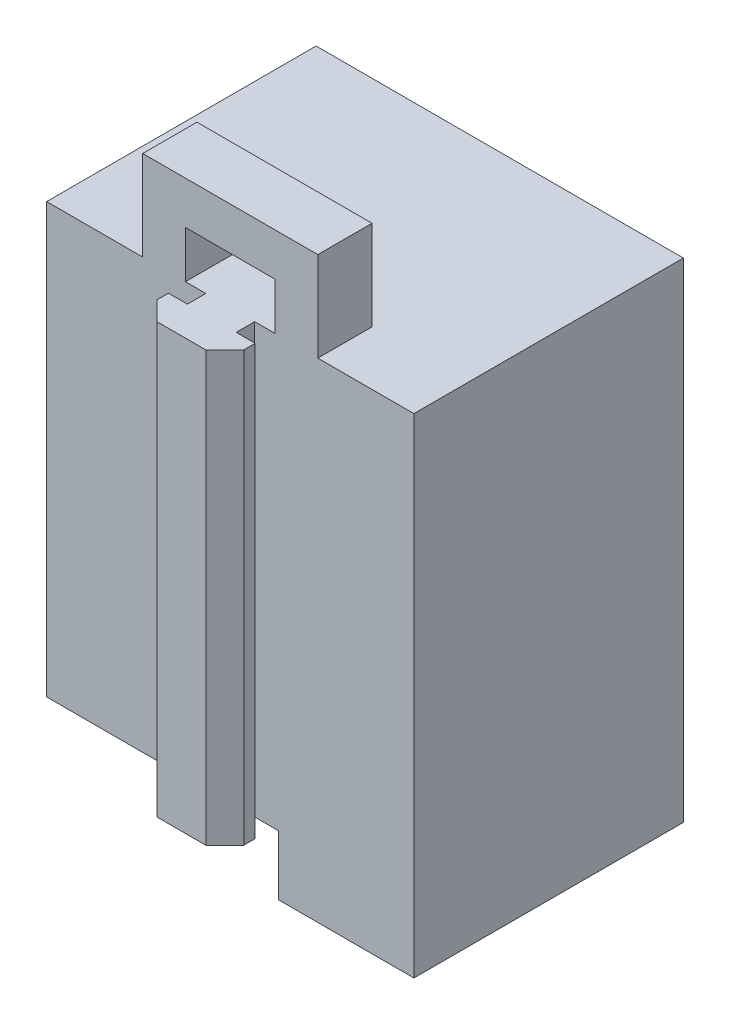
ISO-10303-21;
HEADER;
FILE_DESCRIPTION(('STEP AP214'),'2;1');
FILE_NAME('part.step','',(''),(''),'','','');
FILE_SCHEMA(('AUTOMOTIVE_DESIGN { 1 0 10303 214 1 1 1 1 }'));
ENDSEC;
DATA;
#1=APPLICATION_CONTEXT('core data for automotive mechanical design processes');
#2=APPLICATION_PROTOCOL_DEFINITION('international standard','automotive_design',2000,#1);
#3=PRODUCT_CONTEXT('',#1,'mechanical');
#4=PRODUCT('Part','Part','',(#3));
#5=PRODUCT_RELATED_PRODUCT_CATEGORY('part','',(#4));
#6=PRODUCT_DEFINITION_FORMATION('','',#4);
#7=PRODUCT_DEFINITION_CONTEXT('part definition',#1,'design');
#8=PRODUCT_DEFINITION('design','',#6,#7);
#9=PRODUCT_DEFINITION_SHAPE('','',#8);
#10=(LENGTH_UNIT() NAMED_UNIT(*) SI_UNIT(.MILLI.,.METRE.));
#11=(NAMED_UNIT(*) PLANE_ANGLE_UNIT() SI_UNIT($,.RADIAN.));
#12=(NAMED_UNIT(*) SI_UNIT($,.STERADIAN.) SOLID_ANGLE_UNIT());
#13=UNCERTAINTY_MEASURE_WITH_UNIT(LENGTH_MEASURE(1.E-05),#10,'distance_accuracy_value','');
#14=(GEOMETRIC_REPRESENTATION_CONTEXT(3) GLOBAL_UNCERTAINTY_ASSIGNED_CONTEXT((#13)) GLOBAL_UNIT_ASSIGNED_CONTEXT((#10,
#11,#12)) REPRESENTATION_CONTEXT('',''));
#15=CARTESIAN_POINT('',(0.,0.,0.));
#16=DIRECTION('',(0.,0.,1.));
#17=DIRECTION('',(1.,0.,0.));
#18=AXIS2_PLACEMENT_3D('',#15,#16,#17);
#19=CARTESIAN_POINT('',(0.,0.,6.35));
#20=DIRECTION('',(0.,0.,1.));
#21=DIRECTION('',(1.,0.,0.));
#22=AXIS2_PLACEMENT_3D('',#19,#20,#21);
#23=PLANE('',#22);
#24=DIRECTION('',(1.,0.,0.));
#25=VECTOR('',#24,1.);
#26=CARTESIAN_POINT('',(-21.4999999999999,-29.728,6.35));
#27=LINE('',#26,#25);
#28=CARTESIAN_POINT('',(-21.4999999999999,-29.728,6.35));
#29=VERTEX_POINT('',#28);
#30=CARTESIAN_POINT('',(-2.86,-29.728,6.35));
#31=VERTEX_POINT('',#30);
#32=EDGE_CURVE('E444',#29,#31,#27,.T.);
#33=ORIENTED_EDGE('',*,*,#32,.T.);
#34=DIRECTION('',(0.,1.,0.));
#35=VECTOR('',#34,1.);
#36=CARTESIAN_POINT('',(-2.86,-41.387502562288,6.35));
#37=LINE('',#36,#35);
#38=CARTESIAN_POINT('',(-2.86,20.5,6.35));
#39=VERTEX_POINT('',#38);
#40=EDGE_CURVE('E59',#31,#39,#37,.T.);
#41=ORIENTED_EDGE('',*,*,#40,.T.);
#42=DIRECTION('',(-1.,0.,0.));
#43=VECTOR('',#42,1.);
#44=CARTESIAN_POINT('',(-21.4999999999999,20.5,6.35));
#45=LINE('',#44,#43);
#46=CARTESIAN_POINT('',(-5.25,20.5,6.35));
#47=VERTEX_POINT('',#46);
#48=EDGE_CURVE('E269',#39,#47,#45,.T.);
#49=ORIENTED_EDGE('',*,*,#48,.T.);
#50=DIRECTION('',(0.,1.,0.));
#51=VECTOR('',#50,1.);
#52=CARTESIAN_POINT('',(-5.25,0.,6.35));
#53=LINE('',#52,#51);
#54=CARTESIAN_POINT('',(-5.25,26.,6.35));
#55=VERTEX_POINT('',#54);
#56=EDGE_CURVE('E377',#47,#55,#53,.T.);
#57=ORIENTED_EDGE('',*,*,#56,.T.);
#58=DIRECTION('',(1.,0.,0.));
#59=VECTOR('',#58,1.);
#60=CARTESIAN_POINT('',(0.,26.,6.35));
#61=LINE('',#60,#59);
#62=CARTESIAN_POINT('',(5.25,26.,6.35));
#63=VERTEX_POINT('',#62);
#64=EDGE_CURVE('E381',#55,#63,#61,.T.);
#65=ORIENTED_EDGE('',*,*,#64,.T.);
#66=DIRECTION('',(0.,1.,0.));
#67=VECTOR('',#66,1.);
#68=CARTESIAN_POINT('',(5.25000000000001,0.,6.35));
#69=LINE('',#68,#67);
#70=CARTESIAN_POINT('',(5.25,20.5,6.35));
#71=VERTEX_POINT('',#70);
#72=EDGE_CURVE('E385',#71,#63,#69,.T.);
#73=ORIENTED_EDGE('',*,*,#72,.F.);
#74=CARTESIAN_POINT('',(2.86,20.5,6.35));
#75=VERTEX_POINT('',#74);
#76=EDGE_CURVE('E460',#71,#75,#45,.T.);
#77=ORIENTED_EDGE('',*,*,#76,.T.);
#78=DIRECTION('',(0.,1.,0.));
#79=VECTOR('',#78,1.);
#80=CARTESIAN_POINT('',(2.86000000000001,-41.387502562288,6.35));
#81=LINE('',#80,#79);
#82=CARTESIAN_POINT('',(2.86,-29.728,6.35));
#83=VERTEX_POINT('',#82);
#84=EDGE_CURVE('E66',#83,#75,#81,.T.);
#85=ORIENTED_EDGE('',*,*,#84,.F.);
#86=CARTESIAN_POINT('',(5.67000000000012,-29.728,6.35));
#87=VERTEX_POINT('',#86);
#88=EDGE_CURVE('E443',#83,#87,#27,.T.);
#89=ORIENTED_EDGE('',*,*,#88,.T.);
#90=DIRECTION('',(0.,-1.,0.));
#91=VECTOR('',#90,1.);
#92=CARTESIAN_POINT('',(5.67000000000012,-17.9976504050333,6.35));
#93=LINE('',#92,#91);
#94=CARTESIAN_POINT('',(5.67000000000012,-36.728,6.35));
#95=VERTEX_POINT('',#94);
#96=EDGE_CURVE('E430',#87,#95,#93,.T.);
#97=ORIENTED_EDGE('',*,*,#96,.T.);
#98=DIRECTION('',(1.,0.,0.));
#99=VECTOR('',#98,1.);
#100=CARTESIAN_POINT('',(11.6700000000001,-36.728,6.35));
#101=LINE('',#100,#99);
#102=CARTESIAN_POINT('',(21.5000000000001,-36.728,6.35));
#103=VERTEX_POINT('',#102);
#104=EDGE_CURVE('E447',#95,#103,#101,.T.);
#105=ORIENTED_EDGE('',*,*,#104,.T.);
#106=DIRECTION('',(0.,1.,0.));
#107=VECTOR('',#106,1.);
#108=CARTESIAN_POINT('',(21.5000000000001,-36.728,6.35));
#109=LINE('',#108,#107);
#110=CARTESIAN_POINT('',(21.5000000000001,20.5,6.35));
#111=VERTEX_POINT('',#110);
#112=EDGE_CURVE('E451',#103,#111,#109,.T.);
#113=ORIENTED_EDGE('',*,*,#112,.T.);
#114=CARTESIAN_POINT('',(10.25,20.5,6.35));
#115=VERTEX_POINT('',#114);
#116=EDGE_CURVE('E456',#111,#115,#45,.T.);
#117=ORIENTED_EDGE('',*,*,#116,.T.);
#118=DIRECTION('',(0.,1.,0.));
#119=VECTOR('',#118,1.);
#120=CARTESIAN_POINT('',(10.25,0.,6.35));
#121=LINE('',#120,#119);
#122=CARTESIAN_POINT('',(10.25,31.,6.35));
#123=VERTEX_POINT('',#122);
#124=EDGE_CURVE('E334',#115,#123,#121,.T.);
#125=ORIENTED_EDGE('',*,*,#124,.T.);
#126=DIRECTION('',(1.,0.,0.));
#127=VECTOR('',#126,1.);
#128=CARTESIAN_POINT('',(0.,31.,6.35));
#129=LINE('',#128,#127);
#130=CARTESIAN_POINT('',(-10.25,31.,6.35));
#131=VERTEX_POINT('',#130);
#132=EDGE_CURVE('E369',#131,#123,#129,.T.);
#133=ORIENTED_EDGE('',*,*,#132,.F.);
#134=DIRECTION('',(0.,1.,0.));
#135=VECTOR('',#134,1.);
#136=CARTESIAN_POINT('',(-10.25,0.,6.35));
#137=LINE('',#136,#135);
#138=CARTESIAN_POINT('',(-10.25,20.5,6.35));
#139=VERTEX_POINT('',#138);
#140=EDGE_CURVE('E373',#139,#131,#137,.T.);
#141=ORIENTED_EDGE('',*,*,#140,.F.);
#142=CARTESIAN_POINT('',(-21.4999999999999,20.5,6.35));
#143=VERTEX_POINT('',#142);
#144=EDGE_CURVE('E455',#139,#143,#45,.T.);
#145=ORIENTED_EDGE('',*,*,#144,.T.);
#146=DIRECTION('',(0.,-1.,0.));
#147=VECTOR('',#146,1.);
#148=CARTESIAN_POINT('',(-21.4999999999999,20.5,6.35));
#149=LINE('',#148,#147);
#150=EDGE_CURVE('E439',#143,#29,#149,.T.);
#151=ORIENTED_EDGE('',*,*,#150,.T.);
#152=EDGE_LOOP('',(#33,#41,#49,#57,#65,#73,#77,#85,#89,#97,#105,#113,#117,#125,#133,#141,#145,#151));
#153=FACE_BOUND('',#152,.T.);
#154=ADVANCED_FACE('F41',(#153),#23,.T.);
#155=CARTESIAN_POINT('',(0.,-29.728,-96.78242789959));
#156=DIRECTION('',(0.,1.,0.));
#157=DIRECTION('',(-1.,0.,0.));
#158=AXIS2_PLACEMENT_3D('',#155,#156,#157);
#159=PLANE('',#158);
#160=DIRECTION('',(0.,0.,1.));
#161=VECTOR('',#160,1.);
#162=CARTESIAN_POINT('',(5.67000000000012,-29.728,-23.0325856125621));
#163=LINE('',#162,#161);
#164=CARTESIAN_POINT('',(5.67000000000012,-29.728,0.));
#165=VERTEX_POINT('',#164);
#166=EDGE_CURVE('E329',#165,#87,#163,.T.);
#167=ORIENTED_EDGE('',*,*,#166,.T.);
#168=ORIENTED_EDGE('',*,*,#88,.F.);
#169=DIRECTION('',(0.,0.,1.));
#170=VECTOR('',#169,1.);
#171=CARTESIAN_POINT('',(2.86000000000001,-29.728,8.51));
#172=LINE('',#171,#170);
#173=CARTESIAN_POINT('',(2.86,-29.728,8.51));
#174=VERTEX_POINT('',#173);
#175=EDGE_CURVE('E273',#83,#174,#172,.T.);
#176=ORIENTED_EDGE('',*,*,#175,.T.);
#177=DIRECTION('',(1.,0.,0.));
#178=VECTOR('',#177,1.);
#179=CARTESIAN_POINT('',(5.08000000000001,-29.728,8.51));
#180=LINE('',#179,#178);
#181=CARTESIAN_POINT('',(5.08000000000001,-29.728,8.51));
#182=VERTEX_POINT('',#181);
#183=EDGE_CURVE('E564',#174,#182,#180,.T.);
#184=ORIENTED_EDGE('',*,*,#183,.T.);
#185=DIRECTION('',(0.,0.,1.));
#186=VECTOR('',#185,1.);
#187=CARTESIAN_POINT('',(5.08000000000001,-29.728,9.85));
#188=LINE('',#187,#186);
#189=CARTESIAN_POINT('',(5.08000000000001,-29.728,9.85));
#190=VERTEX_POINT('',#189);
#191=EDGE_CURVE('E566',#182,#190,#188,.T.);
#192=ORIENTED_EDGE('',*,*,#191,.T.);
#193=DIRECTION('',(-0.707106781186548,0.,0.707106781186547));
#194=VECTOR('',#193,1.);
#195=CARTESIAN_POINT('',(2.86000000000001,-29.728,12.07));
#196=LINE('',#195,#194);
#197=CARTESIAN_POINT('',(2.86000000000001,-29.728,12.07));
#198=VERTEX_POINT('',#197);
#199=EDGE_CURVE('E568',#190,#198,#196,.T.);
#200=ORIENTED_EDGE('',*,*,#199,.T.);
#201=DIRECTION('',(-1.,0.,0.));
#202=VECTOR('',#201,1.);
#203=CARTESIAN_POINT('',(-2.86,-29.728,12.07));
#204=LINE('',#203,#202);
#205=CARTESIAN_POINT('',(-2.86,-29.728,12.07));
#206=VERTEX_POINT('',#205);
#207=EDGE_CURVE('E571',#198,#206,#204,.T.);
#208=ORIENTED_EDGE('',*,*,#207,.T.);
#209=DIRECTION('',(-0.707106781186548,0.,-0.707106781186547));
#210=VECTOR('',#209,1.);
#211=CARTESIAN_POINT('',(-5.08,-29.728,9.85));
#212=LINE('',#211,#210);
#213=CARTESIAN_POINT('',(-5.08,-29.728,9.85));
#214=VERTEX_POINT('',#213);
#215=EDGE_CURVE('E574',#206,#214,#212,.T.);
#216=ORIENTED_EDGE('',*,*,#215,.T.);
#217=DIRECTION('',(0.,0.,-1.));
#218=VECTOR('',#217,1.);
#219=CARTESIAN_POINT('',(-5.08,-29.728,8.51));
#220=LINE('',#219,#218);
#221=CARTESIAN_POINT('',(-5.08,-29.728,8.51));
#222=VERTEX_POINT('',#221);
#223=EDGE_CURVE('E577',#214,#222,#220,.T.);
#224=ORIENTED_EDGE('',*,*,#223,.T.);
#225=DIRECTION('',(1.,0.,0.));
#226=VECTOR('',#225,1.);
#227=CARTESIAN_POINT('',(-2.86,-29.728,8.51));
#228=LINE('',#227,#226);
#229=CARTESIAN_POINT('',(-2.86,-29.728,8.51));
#230=VERTEX_POINT('',#229);
#231=EDGE_CURVE('E304',#222,#230,#228,.T.);
#232=ORIENTED_EDGE('',*,*,#231,.T.);
#233=DIRECTION('',(0.,0.,-1.));
#234=VECTOR('',#233,1.);
#235=CARTESIAN_POINT('',(-2.86,-29.728,6.35));
#236=LINE('',#235,#234);
#237=EDGE_CURVE('E250',#230,#31,#236,.T.);
#238=ORIENTED_EDGE('',*,*,#237,.T.);
#239=ORIENTED_EDGE('',*,*,#32,.F.);
#240=DIRECTION('',(0.,0.,1.));
#241=VECTOR('',#240,1.);
#242=CARTESIAN_POINT('',(-21.4999999999999,-29.728,-96.78242789959));
#243=LINE('',#242,#241);
#244=CARTESIAN_POINT('',(-21.4999999999999,-29.728,-25.2));
#245=VERTEX_POINT('',#244);
#246=EDGE_CURVE('E509',#245,#29,#243,.T.);
#247=ORIENTED_EDGE('',*,*,#246,.F.);
#248=DIRECTION('',(-1.,0.,0.));
#249=VECTOR('',#248,1.);
#250=CARTESIAN_POINT('',(0.,-29.728,-25.2));
#251=LINE('',#250,#249);
#252=CARTESIAN_POINT('',(-16.4999999999999,-29.728,-25.2));
#253=VERTEX_POINT('',#252);
#254=EDGE_CURVE('E505',#253,#245,#251,.T.);
#255=ORIENTED_EDGE('',*,*,#254,.F.);
#256=DIRECTION('',(0.,0.,1.));
#257=VECTOR('',#256,1.);
#258=CARTESIAN_POINT('',(-16.4999999999999,-29.728,-96.78242789959));
#259=LINE('',#258,#257);
#260=CARTESIAN_POINT('',(-16.4999999999999,-29.728,0.));
#261=VERTEX_POINT('',#260);
#262=EDGE_CURVE('E45',#253,#261,#259,.T.);
#263=ORIENTED_EDGE('',*,*,#262,.T.);
#264=DIRECTION('',(1.,0.,0.));
#265=VECTOR('',#264,1.);
#266=CARTESIAN_POINT('',(-21.4999999999999,-29.728,0.));
#267=LINE('',#266,#265);
#268=EDGE_CURVE('E421',#261,#165,#267,.T.);
#269=ORIENTED_EDGE('',*,*,#268,.T.);
#270=EDGE_LOOP('',(#167,#168,#176,#184,#192,#200,#208,#216,#224,#232,#238,#239,#247,#255,#263,#269));
#271=FACE_BOUND('',#270,.T.);
#272=ADVANCED_FACE('F555',(#271),#159,.F.);
#273=CARTESIAN_POINT('',(0.,-31.728,-96.78242789959));
#274=DIRECTION('',(0.,-1.,0.));
#275=DIRECTION('',(0.,0.,-1.));
#276=AXIS2_PLACEMENT_3D('',#273,#274,#275);
#277=PLANE('',#276);
#278=DIRECTION('',(0.707106781186544,0.,-0.707106781186551));
#279=VECTOR('',#278,1.);
#280=CARTESIAN_POINT('',(51.2262139497951,-31.728,-45.5562139497954));
#281=LINE('',#280,#279);
#282=CARTESIAN_POINT('',(5.67000000000012,-31.728,0.));
#283=VERTEX_POINT('',#282);
#284=CARTESIAN_POINT('',(11.6700000000001,-31.728,-6.00000000000006));
#285=VERTEX_POINT('',#284);
#286=EDGE_CURVE('E418',#283,#285,#281,.T.);
#287=ORIENTED_EDGE('',*,*,#286,.F.);
#288=DIRECTION('',(1.,0.,0.));
#289=VECTOR('',#288,1.);
#290=CARTESIAN_POINT('',(0.,-31.728,0.));
#291=LINE('',#290,#289);
#292=CARTESIAN_POINT('',(16.5000000000001,-31.728,0.));
#293=VERTEX_POINT('',#292);
#294=EDGE_CURVE('E464',#283,#293,#291,.T.);
#295=ORIENTED_EDGE('',*,*,#294,.T.);
#296=DIRECTION('',(0.,0.,1.));
#297=VECTOR('',#296,1.);
#298=CARTESIAN_POINT('',(16.5000000000001,-31.728,-96.78242789959));
#299=LINE('',#298,#297);
#300=CARTESIAN_POINT('',(16.5000000000001,-31.728,-25.2));
#301=VERTEX_POINT('',#300);
#302=EDGE_CURVE('E486',#301,#293,#299,.T.);
#303=ORIENTED_EDGE('',*,*,#302,.F.);
#304=DIRECTION('',(1.,0.,0.));
#305=VECTOR('',#304,1.);
#306=CARTESIAN_POINT('',(0.,-31.728,-25.2));
#307=LINE('',#306,#305);
#308=CARTESIAN_POINT('',(11.6700000000001,-31.728,-25.2));
#309=VERTEX_POINT('',#308);
#310=EDGE_CURVE('E11',#309,#301,#307,.T.);
#311=ORIENTED_EDGE('',*,*,#310,.F.);
#312=DIRECTION('',(0.,0.,1.));
#313=VECTOR('',#312,1.);
#314=CARTESIAN_POINT('',(11.6700000000001,-31.728,-96.78242789959));
#315=LINE('',#314,#313);
#316=EDGE_CURVE('E469',#309,#285,#315,.T.);
#317=ORIENTED_EDGE('',*,*,#316,.T.);
#318=EDGE_LOOP('',(#287,#295,#303,#311,#317));
#319=FACE_BOUND('',#318,.T.);
#320=ADVANCED_FACE('F675',(#319),#277,.F.);
#321=CARTESIAN_POINT('',(0.,20.5,-96.78242789959));
#322=DIRECTION('',(0.,-1.,0.));
#323=DIRECTION('',(1.,0.,0.));
#324=AXIS2_PLACEMENT_3D('',#321,#322,#323);
#325=PLANE('',#324);
#326=DIRECTION('',(0.,0.,1.));
#327=VECTOR('',#326,1.);
#328=CARTESIAN_POINT('',(5.25,20.5,-23.0325856125621));
#329=LINE('',#328,#327);
#330=CARTESIAN_POINT('',(5.25,20.5,0.));
#331=VERTEX_POINT('',#330);
#332=EDGE_CURVE('E343',#331,#71,#329,.T.);
#333=ORIENTED_EDGE('',*,*,#332,.F.);
#334=DIRECTION('',(1.,0.,0.));
#335=VECTOR('',#334,1.);
#336=CARTESIAN_POINT('',(0.,20.5,0.));
#337=LINE('',#336,#335);
#338=CARTESIAN_POINT('',(10.25,20.5,0.));
#339=VERTEX_POINT('',#338);
#340=EDGE_CURVE('E361',#331,#339,#337,.T.);
#341=ORIENTED_EDGE('',*,*,#340,.T.);
#342=DIRECTION('',(0.,0.,1.));
#343=VECTOR('',#342,1.);
#344=CARTESIAN_POINT('',(10.25,20.5,-23.0325856125621));
#345=LINE('',#344,#343);
#346=EDGE_CURVE('E389',#339,#115,#345,.T.);
#347=ORIENTED_EDGE('',*,*,#346,.T.);
#348=ORIENTED_EDGE('',*,*,#116,.F.);
#349=DIRECTION('',(0.,0.,1.));
#350=VECTOR('',#349,1.);
#351=CARTESIAN_POINT('',(21.5000000000001,20.5,-96.78242789959));
#352=LINE('',#351,#350);
#353=CARTESIAN_POINT('',(21.5000000000001,20.5,-25.2));
#354=VERTEX_POINT('',#353);
#355=EDGE_CURVE('E497',#354,#111,#352,.T.);
#356=ORIENTED_EDGE('',*,*,#355,.F.);
#357=DIRECTION('',(1.,0.,0.));
#358=VECTOR('',#357,1.);
#359=CARTESIAN_POINT('',(0.,20.5,-25.2));
#360=LINE('',#359,#358);
#361=CARTESIAN_POINT('',(-21.4999999999999,20.5,-25.2));
#362=VERTEX_POINT('',#361);
#363=EDGE_CURVE('E501',#362,#354,#360,.T.);
#364=ORIENTED_EDGE('',*,*,#363,.F.);
#365=DIRECTION('',(0.,0.,1.));
#366=VECTOR('',#365,1.);
#367=CARTESIAN_POINT('',(-21.4999999999999,20.5,-96.78242789959));
#368=LINE('',#367,#366);
#369=EDGE_CURVE('E518',#362,#143,#368,.T.);
#370=ORIENTED_EDGE('',*,*,#369,.T.);
#371=ORIENTED_EDGE('',*,*,#144,.F.);
#372=DIRECTION('',(0.,0.,1.));
#373=VECTOR('',#372,1.);
#374=CARTESIAN_POINT('',(-10.25,20.5,-23.0325856125621));
#375=LINE('',#374,#373);
#376=CARTESIAN_POINT('',(-10.25,20.5,0.));
#377=VERTEX_POINT('',#376);
#378=EDGE_CURVE('E402',#377,#139,#375,.T.);
#379=ORIENTED_EDGE('',*,*,#378,.F.);
#380=DIRECTION('',(1.,0.,0.));
#381=VECTOR('',#380,1.);
#382=CARTESIAN_POINT('',(0.,20.5,0.));
#383=LINE('',#382,#381);
#384=CARTESIAN_POINT('',(-5.25,20.5,0.));
#385=VERTEX_POINT('',#384);
#386=EDGE_CURVE('E347',#377,#385,#383,.T.);
#387=ORIENTED_EDGE('',*,*,#386,.T.);
#388=DIRECTION('',(0.,0.,1.));
#389=VECTOR('',#388,1.);
#390=CARTESIAN_POINT('',(-5.25,20.5,-23.0325856125621));
#391=LINE('',#390,#389);
#392=EDGE_CURVE('E399',#385,#47,#391,.T.);
#393=ORIENTED_EDGE('',*,*,#392,.T.);
#394=ORIENTED_EDGE('',*,*,#48,.F.);
#395=DIRECTION('',(0.,0.,1.));
#396=VECTOR('',#395,1.);
#397=CARTESIAN_POINT('',(-2.86000000000001,20.5,6.35));
#398=LINE('',#397,#396);
#399=CARTESIAN_POINT('',(-2.86000000000001,20.5,8.51));
#400=VERTEX_POINT('',#399);
#401=EDGE_CURVE('E248',#39,#400,#398,.T.);
#402=ORIENTED_EDGE('',*,*,#401,.T.);
#403=DIRECTION('',(-1.,0.,0.));
#404=VECTOR('',#403,1.);
#405=CARTESIAN_POINT('',(-2.86000000000001,20.5,8.51));
#406=LINE('',#405,#404);
#407=CARTESIAN_POINT('',(-5.08000000000001,20.5,8.51));
#408=VERTEX_POINT('',#407);
#409=EDGE_CURVE('E257',#400,#408,#406,.T.);
#410=ORIENTED_EDGE('',*,*,#409,.T.);
#411=DIRECTION('',(0.,0.,1.));
#412=VECTOR('',#411,1.);
#413=CARTESIAN_POINT('',(-5.08000000000001,20.5,8.51));
#414=LINE('',#413,#412);
#415=CARTESIAN_POINT('',(-5.08000000000001,20.5,9.85));
#416=VERTEX_POINT('',#415);
#417=EDGE_CURVE('E264',#408,#416,#414,.T.);
#418=ORIENTED_EDGE('',*,*,#417,.T.);
#419=DIRECTION('',(0.707106781186548,0.,0.707106781186547));
#420=VECTOR('',#419,1.);
#421=CARTESIAN_POINT('',(-5.08000000000001,20.5,9.85));
#422=LINE('',#421,#420);
#423=CARTESIAN_POINT('',(-2.86,20.5,12.07));
#424=VERTEX_POINT('',#423);
#425=EDGE_CURVE('E278',#416,#424,#422,.T.);
#426=ORIENTED_EDGE('',*,*,#425,.T.);
#427=DIRECTION('',(1.,0.,0.));
#428=VECTOR('',#427,1.);
#429=CARTESIAN_POINT('',(-2.86,20.5,12.07));
#430=LINE('',#429,#428);
#431=CARTESIAN_POINT('',(2.86,20.5,12.07));
#432=VERTEX_POINT('',#431);
#433=EDGE_CURVE('E282',#424,#432,#430,.T.);
#434=ORIENTED_EDGE('',*,*,#433,.T.);
#435=DIRECTION('',(0.707106781186548,0.,-0.707106781186547));
#436=VECTOR('',#435,1.);
#437=CARTESIAN_POINT('',(2.86,20.5,12.07));
#438=LINE('',#437,#436);
#439=CARTESIAN_POINT('',(5.08,20.5,9.85));
#440=VERTEX_POINT('',#439);
#441=EDGE_CURVE('E286',#432,#440,#438,.T.);
#442=ORIENTED_EDGE('',*,*,#441,.T.);
#443=DIRECTION('',(0.,0.,-1.));
#444=VECTOR('',#443,1.);
#445=CARTESIAN_POINT('',(5.08,20.5,9.85));
#446=LINE('',#445,#444);
#447=CARTESIAN_POINT('',(5.08,20.5,8.51));
#448=VERTEX_POINT('',#447);
#449=EDGE_CURVE('E290',#440,#448,#446,.T.);
#450=ORIENTED_EDGE('',*,*,#449,.T.);
#451=DIRECTION('',(-1.,0.,0.));
#452=VECTOR('',#451,1.);
#453=CARTESIAN_POINT('',(5.08,20.5,8.51));
#454=LINE('',#453,#452);
#455=CARTESIAN_POINT('',(2.86,20.5,8.51));
#456=VERTEX_POINT('',#455);
#457=EDGE_CURVE('E294',#448,#456,#454,.T.);
#458=ORIENTED_EDGE('',*,*,#457,.T.);
#459=DIRECTION('',(0.,0.,-1.));
#460=VECTOR('',#459,1.);
#461=CARTESIAN_POINT('',(2.86,20.5,8.51));
#462=LINE('',#461,#460);
#463=EDGE_CURVE('E298',#456,#75,#462,.T.);
#464=ORIENTED_EDGE('',*,*,#463,.T.);
#465=ORIENTED_EDGE('',*,*,#76,.F.);
#466=EDGE_LOOP('',(#333,#341,#347,#348,#356,#364,#370,#371,#379,#387,#393,#394,#402,#410,#418,
#426,#434,#442,#450,#458,#464,#465));
#467=FACE_BOUND('',#466,.T.);
#468=ADVANCED_FACE('F267',(#467),#325,.F.);
#469=CARTESIAN_POINT('',(11.6700000000001,0.,-96.78242789959));
#470=DIRECTION('',(1.,0.,0.));
#471=DIRECTION('',(0.,0.,-1.));
#472=AXIS2_PLACEMENT_3D('',#469,#470,#471);
#473=PLANE('',#472);
#474=DIRECTION('',(0.,-1.,0.));
#475=VECTOR('',#474,1.);
#476=CARTESIAN_POINT('',(11.6700000000001,-17.9976504050333,-6.00000000000006));
#477=LINE('',#476,#475);
#478=CARTESIAN_POINT('',(11.6700000000001,-36.728,-6.00000000000006));
#479=VERTEX_POINT('',#478);
#480=EDGE_CURVE('E422',#285,#479,#477,.T.);
#481=ORIENTED_EDGE('',*,*,#480,.F.);
#482=ORIENTED_EDGE('',*,*,#316,.F.);
#483=DIRECTION('',(0.,1.,0.));
#484=VECTOR('',#483,1.);
#485=CARTESIAN_POINT('',(11.6700000000001,0.,-25.2));
#486=LINE('',#485,#484);
#487=CARTESIAN_POINT('',(11.6700000000001,-36.728,-25.2));
#488=VERTEX_POINT('',#487);
#489=EDGE_CURVE('E51',#488,#309,#486,.T.);
#490=ORIENTED_EDGE('',*,*,#489,.F.);
#491=DIRECTION('',(0.,0.,1.));
#492=VECTOR('',#491,1.);
#493=CARTESIAN_POINT('',(11.6700000000001,-36.728,-96.78242789959));
#494=LINE('',#493,#492);
#495=EDGE_CURVE('E526',#488,#479,#494,.T.);
#496=ORIENTED_EDGE('',*,*,#495,.T.);
#497=EDGE_LOOP('',(#481,#482,#490,#496));
#498=FACE_BOUND('',#497,.T.);
#499=ADVANCED_FACE('F659',(#498),#473,.F.);
#500=CARTESIAN_POINT('',(-21.4999999999999,0.,-96.78242789959));
#501=DIRECTION('',(-1.,0.,0.));
#502=DIRECTION('',(0.,-1.,0.));
#503=AXIS2_PLACEMENT_3D('',#500,#501,#502);
#504=PLANE('',#503);
#505=ORIENTED_EDGE('',*,*,#369,.F.);
#506=DIRECTION('',(0.,-1.,0.));
#507=VECTOR('',#506,1.);
#508=CARTESIAN_POINT('',(-21.4999999999999,0.,-25.2));
#509=LINE('',#508,#507);
#510=EDGE_CURVE('E506',#362,#245,#509,.T.);
#511=ORIENTED_EDGE('',*,*,#510,.T.);
#512=ORIENTED_EDGE('',*,*,#246,.T.);
#513=ORIENTED_EDGE('',*,*,#150,.F.);
#514=EDGE_LOOP('',(#505,#511,#512,#513));
#515=FACE_BOUND('',#514,.T.);
#516=ADVANCED_FACE('F657',(#515),#504,.T.);
#517=CARTESIAN_POINT('',(21.5000000000001,0.,-96.78242789959));
#518=DIRECTION('',(-1.,0.,0.));
#519=DIRECTION('',(0.,0.,1.));
#520=AXIS2_PLACEMENT_3D('',#517,#518,#519);
#521=PLANE('',#520);
#522=DIRECTION('',(0.,-1.,0.));
#523=VECTOR('',#522,1.);
#524=CARTESIAN_POINT('',(21.5000000000001,0.,-25.2));
#525=LINE('',#524,#523);
#526=CARTESIAN_POINT('',(21.5000000000001,-36.728,-25.2));
#527=VERTEX_POINT('',#526);
#528=EDGE_CURVE('E492',#354,#527,#525,.T.);
#529=ORIENTED_EDGE('',*,*,#528,.F.);
#530=ORIENTED_EDGE('',*,*,#355,.T.);
#531=ORIENTED_EDGE('',*,*,#112,.F.);
#532=DIRECTION('',(0.,0.,1.));
#533=VECTOR('',#532,1.);
#534=CARTESIAN_POINT('',(21.5000000000001,-36.728,-96.78242789959));
#535=LINE('',#534,#533);
#536=EDGE_CURVE('E496',#527,#103,#535,.T.);
#537=ORIENTED_EDGE('',*,*,#536,.F.);
#538=EDGE_LOOP('',(#529,#530,#531,#537));
#539=FACE_BOUND('',#538,.T.);
#540=ADVANCED_FACE('F652',(#539),#521,.F.);
#541=CARTESIAN_POINT('',(0.,-36.728,-96.78242789959));
#542=DIRECTION('',(0.,-1.,0.));
#543=DIRECTION('',(0.,0.,-1.));
#544=AXIS2_PLACEMENT_3D('',#541,#542,#543);
#545=PLANE('',#544);
#546=ORIENTED_EDGE('',*,*,#495,.F.);
#547=DIRECTION('',(1.,0.,0.));
#548=VECTOR('',#547,1.);
#549=CARTESIAN_POINT('',(0.,-36.728,-25.2));
#550=LINE('',#549,#548);
#551=EDGE_CURVE('E493',#488,#527,#550,.T.);
#552=ORIENTED_EDGE('',*,*,#551,.T.);
#553=ORIENTED_EDGE('',*,*,#536,.T.);
#554=ORIENTED_EDGE('',*,*,#104,.F.);
#555=DIRECTION('',(0.,0.,1.));
#556=VECTOR('',#555,1.);
#557=CARTESIAN_POINT('',(5.67000000000012,-36.728,-96.78242789959));
#558=LINE('',#557,#556);
#559=CARTESIAN_POINT('',(5.67000000000012,-36.728,0.));
#560=VERTEX_POINT('',#559);
#561=EDGE_CURVE('E426',#560,#95,#558,.T.);
#562=ORIENTED_EDGE('',*,*,#561,.F.);
#563=DIRECTION('',(-0.707106781186544,0.,0.707106781186551));
#564=VECTOR('',#563,1.);
#565=CARTESIAN_POINT('',(51.2262139497951,-36.728,-45.5562139497954));
#566=LINE('',#565,#564);
#567=EDGE_CURVE('E417',#479,#560,#566,.T.);
#568=ORIENTED_EDGE('',*,*,#567,.F.);
#569=EDGE_LOOP('',(#546,#552,#553,#554,#562,#568));
#570=FACE_BOUND('',#569,.T.);
#571=ADVANCED_FACE('F665',(#570),#545,.T.);
#572=CARTESIAN_POINT('',(16.5000000000001,0.,-96.78242789959));
#573=DIRECTION('',(-1.,0.,0.));
#574=DIRECTION('',(0.,-1.,0.));
#575=AXIS2_PLACEMENT_3D('',#572,#573,#574);
#576=PLANE('',#575);
#577=DIRECTION('',(0.,0.,1.));
#578=VECTOR('',#577,1.);
#579=CARTESIAN_POINT('',(16.5000000000001,15.5,-96.78242789959));
#580=LINE('',#579,#578);
#581=CARTESIAN_POINT('',(16.5000000000001,15.5,-25.2));
#582=VERTEX_POINT('',#581);
#583=CARTESIAN_POINT('',(16.5000000000001,15.5,0.));
#584=VERTEX_POINT('',#583);
#585=EDGE_CURVE('E485',#582,#584,#580,.T.);
#586=ORIENTED_EDGE('',*,*,#585,.F.);
#587=DIRECTION('',(0.,-1.,0.));
#588=VECTOR('',#587,1.);
#589=CARTESIAN_POINT('',(16.5000000000001,0.,-25.2));
#590=LINE('',#589,#588);
#591=EDGE_CURVE('E468',#582,#301,#590,.T.);
#592=ORIENTED_EDGE('',*,*,#591,.T.);
#593=ORIENTED_EDGE('',*,*,#302,.T.);
#594=DIRECTION('',(0.,-1.,0.));
#595=VECTOR('',#594,1.);
#596=CARTESIAN_POINT('',(16.5000000000001,0.,0.));
#597=LINE('',#596,#595);
#598=EDGE_CURVE('E470',#584,#293,#597,.T.);
#599=ORIENTED_EDGE('',*,*,#598,.F.);
#600=EDGE_LOOP('',(#586,#592,#593,#599));
#601=FACE_BOUND('',#600,.T.);
#602=ADVANCED_FACE('F687',(#601),#576,.T.);
#603=CARTESIAN_POINT('',(0.,15.5,-96.78242789959));
#604=DIRECTION('',(0.,-1.,0.));
#605=DIRECTION('',(0.,0.,-1.));
#606=AXIS2_PLACEMENT_3D('',#603,#604,#605);
#607=PLANE('',#606);
#608=DIRECTION('',(0.,0.,1.));
#609=VECTOR('',#608,1.);
#610=CARTESIAN_POINT('',(-16.4999999999999,15.5,-96.78242789959));
#611=LINE('',#610,#609);
#612=CARTESIAN_POINT('',(-16.4999999999999,15.5,-25.2));
#613=VERTEX_POINT('',#612);
#614=CARTESIAN_POINT('',(-16.4999999999999,15.5,0.));
#615=VERTEX_POINT('',#614);
#616=EDGE_CURVE('E481',#613,#615,#611,.T.);
#617=ORIENTED_EDGE('',*,*,#616,.F.);
#618=DIRECTION('',(1.,0.,0.));
#619=VECTOR('',#618,1.);
#620=CARTESIAN_POINT('',(0.,15.5,-25.2));
#621=LINE('',#620,#619);
#622=EDGE_CURVE('E482',#613,#582,#621,.T.);
#623=ORIENTED_EDGE('',*,*,#622,.T.);
#624=ORIENTED_EDGE('',*,*,#585,.T.);
#625=DIRECTION('',(1.,0.,0.));
#626=VECTOR('',#625,1.);
#627=CARTESIAN_POINT('',(0.,15.5,0.));
#628=LINE('',#627,#626);
#629=EDGE_CURVE('E474',#615,#584,#628,.T.);
#630=ORIENTED_EDGE('',*,*,#629,.F.);
#631=EDGE_LOOP('',(#617,#623,#624,#630));
#632=FACE_BOUND('',#631,.T.);
#633=ADVANCED_FACE('F546',(#632),#607,.T.);
#634=CARTESIAN_POINT('',(-16.4999999999999,0.,-96.78242789959));
#635=DIRECTION('',(-1.,0.,0.));
#636=DIRECTION('',(0.,-1.,0.));
#637=AXIS2_PLACEMENT_3D('',#634,#635,#636);
#638=PLANE('',#637);
#639=DIRECTION('',(0.,-1.,0.));
#640=VECTOR('',#639,1.);
#641=CARTESIAN_POINT('',(-16.4999999999999,0.,-25.2));
#642=LINE('',#641,#640);
#643=EDGE_CURVE('E473',#613,#253,#642,.T.);
#644=ORIENTED_EDGE('',*,*,#643,.F.);
#645=ORIENTED_EDGE('',*,*,#616,.T.);
#646=DIRECTION('',(0.,-1.,0.));
#647=VECTOR('',#646,1.);
#648=CARTESIAN_POINT('',(-16.4999999999999,0.,0.));
#649=LINE('',#648,#647);
#650=EDGE_CURVE('E477',#615,#261,#649,.T.);
#651=ORIENTED_EDGE('',*,*,#650,.T.);
#652=ORIENTED_EDGE('',*,*,#262,.F.);
#653=EDGE_LOOP('',(#644,#645,#651,#652));
#654=FACE_BOUND('',#653,.T.);
#655=ADVANCED_FACE('F543',(#654),#638,.F.);
#656=CARTESIAN_POINT('',(0.,0.,-25.2));
#657=DIRECTION('',(0.,0.,-1.));
#658=DIRECTION('',(0.,-1.,0.));
#659=AXIS2_PLACEMENT_3D('',#656,#657,#658);
#660=PLANE('',#659);
#661=ORIENTED_EDGE('',*,*,#643,.T.);
#662=ORIENTED_EDGE('',*,*,#254,.T.);
#663=ORIENTED_EDGE('',*,*,#510,.F.);
#664=ORIENTED_EDGE('',*,*,#363,.T.);
#665=ORIENTED_EDGE('',*,*,#528,.T.);
#666=ORIENTED_EDGE('',*,*,#551,.F.);
#667=ORIENTED_EDGE('',*,*,#489,.T.);
#668=ORIENTED_EDGE('',*,*,#310,.T.);
#669=ORIENTED_EDGE('',*,*,#591,.F.);
#670=ORIENTED_EDGE('',*,*,#622,.F.);
#671=EDGE_LOOP('',(#661,#662,#663,#664,#665,#666,#667,#668,#669,#670));
#672=FACE_BOUND('',#671,.T.);
#673=ADVANCED_FACE('F43',(#672),#660,.T.);
#674=CARTESIAN_POINT('',(0.,0.,0.));
#675=DIRECTION('',(0.,0.,1.));
#676=DIRECTION('',(1.,0.,0.));
#677=AXIS2_PLACEMENT_3D('',#674,#675,#676);
#678=PLANE('',#677);
#679=ORIENTED_EDGE('',*,*,#294,.F.);
#680=DIRECTION('',(0.,-1.,0.));
#681=VECTOR('',#680,1.);
#682=CARTESIAN_POINT('',(5.67000000000012,0.,0.));
#683=LINE('',#682,#681);
#684=EDGE_CURVE('E330',#165,#283,#683,.T.);
#685=ORIENTED_EDGE('',*,*,#684,.F.);
#686=ORIENTED_EDGE('',*,*,#268,.F.);
#687=ORIENTED_EDGE('',*,*,#650,.F.);
#688=ORIENTED_EDGE('',*,*,#629,.T.);
#689=ORIENTED_EDGE('',*,*,#598,.T.);
#690=EDGE_LOOP('',(#679,#685,#686,#687,#688,#689));
#691=FACE_BOUND('',#690,.T.);
#692=ADVANCED_FACE('F550',(#691),#678,.F.);
#693=CARTESIAN_POINT('',(5.67000000000012,-17.9976504050333,-96.78242789959));
#694=DIRECTION('',(1.,0.,0.));
#695=DIRECTION('',(0.,1.,0.));
#696=AXIS2_PLACEMENT_3D('',#693,#694,#695);
#697=PLANE('',#696);
#698=ORIENTED_EDGE('',*,*,#96,.F.);
#699=ORIENTED_EDGE('',*,*,#166,.F.);
#700=ORIENTED_EDGE('',*,*,#684,.T.);
#701=DIRECTION('',(0.,-1.,0.));
#702=VECTOR('',#701,1.);
#703=CARTESIAN_POINT('',(5.67000000000012,-17.9976504050333,0.));
#704=LINE('',#703,#702);
#705=EDGE_CURVE('E434',#283,#560,#704,.T.);
#706=ORIENTED_EDGE('',*,*,#705,.T.);
#707=ORIENTED_EDGE('',*,*,#561,.T.);
#708=EDGE_LOOP('',(#698,#699,#700,#706,#707));
#709=FACE_BOUND('',#708,.T.);
#710=ADVANCED_FACE('F682',(#709),#697,.F.);
#711=CARTESIAN_POINT('',(51.2262139497951,-17.9976504050333,-45.5562139497954));
#712=DIRECTION('',(0.707106781186551,0.,0.707106781186544));
#713=DIRECTION('',(0.707106781186544,0.,-0.707106781186551));
#714=AXIS2_PLACEMENT_3D('',#711,#712,#713);
#715=PLANE('',#714);
#716=ORIENTED_EDGE('',*,*,#705,.F.);
#717=ORIENTED_EDGE('',*,*,#286,.T.);
#718=ORIENTED_EDGE('',*,*,#480,.T.);
#719=ORIENTED_EDGE('',*,*,#567,.T.);
#720=EDGE_LOOP('',(#716,#717,#718,#719));
#721=FACE_BOUND('',#720,.T.);
#722=ADVANCED_FACE('F678',(#721),#715,.F.);
#723=CARTESIAN_POINT('',(5.25000000000001,0.,-23.0325856125621));
#724=DIRECTION('',(1.,0.,0.));
#725=DIRECTION('',(0.,1.,0.));
#726=AXIS2_PLACEMENT_3D('',#723,#724,#725);
#727=PLANE('',#726);
#728=DIRECTION('',(0.,0.,1.));
#729=VECTOR('',#728,1.);
#730=CARTESIAN_POINT('',(5.25,26.,-23.0325856125621));
#731=LINE('',#730,#729);
#732=CARTESIAN_POINT('',(5.25,26.,0.));
#733=VERTEX_POINT('',#732);
#734=EDGE_CURVE('E393',#733,#63,#731,.T.);
#735=ORIENTED_EDGE('',*,*,#734,.F.);
#736=DIRECTION('',(0.,-1.,0.));
#737=VECTOR('',#736,1.);
#738=CARTESIAN_POINT('',(5.25000000000001,0.,0.));
#739=LINE('',#738,#737);
#740=EDGE_CURVE('E357',#733,#331,#739,.T.);
#741=ORIENTED_EDGE('',*,*,#740,.T.);
#742=ORIENTED_EDGE('',*,*,#332,.T.);
#743=ORIENTED_EDGE('',*,*,#72,.T.);
#744=EDGE_LOOP('',(#735,#741,#742,#743));
#745=FACE_BOUND('',#744,.T.);
#746=ADVANCED_FACE('F620',(#745),#727,.F.);
#747=CARTESIAN_POINT('',(0.,26.,-23.0325856125621));
#748=DIRECTION('',(0.,-1.,0.));
#749=DIRECTION('',(0.,0.,-1.));
#750=AXIS2_PLACEMENT_3D('',#747,#748,#749);
#751=PLANE('',#750);
#752=DIRECTION('',(-1.,0.,0.));
#753=VECTOR('',#752,1.);
#754=CARTESIAN_POINT('',(0.,26.,0.));
#755=LINE('',#754,#753);
#756=CARTESIAN_POINT('',(-5.25,26.,0.));
#757=VERTEX_POINT('',#756);
#758=EDGE_CURVE('E354',#733,#757,#755,.T.);
#759=ORIENTED_EDGE('',*,*,#758,.F.);
#760=ORIENTED_EDGE('',*,*,#734,.T.);
#761=ORIENTED_EDGE('',*,*,#64,.F.);
#762=DIRECTION('',(0.,0.,1.));
#763=VECTOR('',#762,1.);
#764=CARTESIAN_POINT('',(-5.25,26.,-23.0325856125621));
#765=LINE('',#764,#763);
#766=EDGE_CURVE('E396',#757,#55,#765,.T.);
#767=ORIENTED_EDGE('',*,*,#766,.F.);
#768=EDGE_LOOP('',(#759,#760,#761,#767));
#769=FACE_BOUND('',#768,.T.);
#770=ADVANCED_FACE('F627',(#769),#751,.T.);
#771=CARTESIAN_POINT('',(-5.25,0.,-23.0325856125621));
#772=DIRECTION('',(1.,0.,0.));
#773=DIRECTION('',(0.,0.,-1.));
#774=AXIS2_PLACEMENT_3D('',#771,#772,#773);
#775=PLANE('',#774);
#776=DIRECTION('',(0.,-1.,0.));
#777=VECTOR('',#776,1.);
#778=CARTESIAN_POINT('',(-5.25,0.,0.));
#779=LINE('',#778,#777);
#780=EDGE_CURVE('E351',#757,#385,#779,.T.);
#781=ORIENTED_EDGE('',*,*,#780,.F.);
#782=ORIENTED_EDGE('',*,*,#766,.T.);
#783=ORIENTED_EDGE('',*,*,#56,.F.);
#784=ORIENTED_EDGE('',*,*,#392,.F.);
#785=EDGE_LOOP('',(#781,#782,#783,#784));
#786=FACE_BOUND('',#785,.T.);
#787=ADVANCED_FACE('F630',(#786),#775,.T.);
#788=CARTESIAN_POINT('',(-10.25,0.,-23.0325856125621));
#789=DIRECTION('',(1.,0.,0.));
#790=DIRECTION('',(0.,1.,0.));
#791=AXIS2_PLACEMENT_3D('',#788,#789,#790);
#792=PLANE('',#791);
#793=DIRECTION('',(0.,0.,1.));
#794=VECTOR('',#793,1.);
#795=CARTESIAN_POINT('',(-10.25,31.,-23.0325856125621));
#796=LINE('',#795,#794);
#797=CARTESIAN_POINT('',(-10.25,31.,0.));
#798=VERTEX_POINT('',#797);
#799=EDGE_CURVE('E406',#798,#131,#796,.T.);
#800=ORIENTED_EDGE('',*,*,#799,.F.);
#801=DIRECTION('',(0.,-1.,0.));
#802=VECTOR('',#801,1.);
#803=CARTESIAN_POINT('',(-10.25,0.,0.));
#804=LINE('',#803,#802);
#805=EDGE_CURVE('E342',#798,#377,#804,.T.);
#806=ORIENTED_EDGE('',*,*,#805,.T.);
#807=ORIENTED_EDGE('',*,*,#378,.T.);
#808=ORIENTED_EDGE('',*,*,#140,.T.);
#809=EDGE_LOOP('',(#800,#806,#807,#808));
#810=FACE_BOUND('',#809,.T.);
#811=ADVANCED_FACE('F635',(#810),#792,.F.);
#812=CARTESIAN_POINT('',(0.,31.,-23.0325856125621));
#813=DIRECTION('',(0.,-1.,0.));
#814=DIRECTION('',(0.,0.,-1.));
#815=AXIS2_PLACEMENT_3D('',#812,#813,#814);
#816=PLANE('',#815);
#817=DIRECTION('',(0.,0.,1.));
#818=VECTOR('',#817,1.);
#819=CARTESIAN_POINT('',(10.25,31.,-23.0325856125621));
#820=LINE('',#819,#818);
#821=CARTESIAN_POINT('',(10.25,31.,0.));
#822=VERTEX_POINT('',#821);
#823=EDGE_CURVE('E409',#822,#123,#820,.T.);
#824=ORIENTED_EDGE('',*,*,#823,.F.);
#825=DIRECTION('',(-1.,0.,0.));
#826=VECTOR('',#825,1.);
#827=CARTESIAN_POINT('',(0.,31.,0.));
#828=LINE('',#827,#826);
#829=EDGE_CURVE('E338',#822,#798,#828,.T.);
#830=ORIENTED_EDGE('',*,*,#829,.T.);
#831=ORIENTED_EDGE('',*,*,#799,.T.);
#832=ORIENTED_EDGE('',*,*,#132,.T.);
#833=EDGE_LOOP('',(#824,#830,#831,#832));
#834=FACE_BOUND('',#833,.T.);
#835=ADVANCED_FACE('F642',(#834),#816,.F.);
#836=CARTESIAN_POINT('',(10.25,0.,-23.0325856125621));
#837=DIRECTION('',(1.,0.,0.));
#838=DIRECTION('',(0.,1.,0.));
#839=AXIS2_PLACEMENT_3D('',#836,#837,#838);
#840=PLANE('',#839);
#841=DIRECTION('',(0.,-1.,0.));
#842=VECTOR('',#841,1.);
#843=CARTESIAN_POINT('',(10.25,0.,0.));
#844=LINE('',#843,#842);
#845=EDGE_CURVE('E365',#822,#339,#844,.T.);
#846=ORIENTED_EDGE('',*,*,#845,.F.);
#847=ORIENTED_EDGE('',*,*,#823,.T.);
#848=ORIENTED_EDGE('',*,*,#124,.F.);
#849=ORIENTED_EDGE('',*,*,#346,.F.);
#850=EDGE_LOOP('',(#846,#847,#848,#849));
#851=FACE_BOUND('',#850,.T.);
#852=ADVANCED_FACE('F646',(#851),#840,.T.);
#853=CARTESIAN_POINT('',(0.,0.,0.));
#854=DIRECTION('',(0.,0.,1.));
#855=DIRECTION('',(1.,0.,0.));
#856=AXIS2_PLACEMENT_3D('',#853,#854,#855);
#857=PLANE('',#856);
#858=ORIENTED_EDGE('',*,*,#740,.F.);
#859=ORIENTED_EDGE('',*,*,#758,.T.);
#860=ORIENTED_EDGE('',*,*,#780,.T.);
#861=ORIENTED_EDGE('',*,*,#386,.F.);
#862=ORIENTED_EDGE('',*,*,#805,.F.);
#863=ORIENTED_EDGE('',*,*,#829,.F.);
#864=ORIENTED_EDGE('',*,*,#845,.T.);
#865=ORIENTED_EDGE('',*,*,#340,.F.);
#866=EDGE_LOOP('',(#858,#859,#860,#861,#862,#863,#864,#865));
#867=FACE_BOUND('',#866,.T.);
#868=ADVANCED_FACE('F623',(#867),#857,.F.);
#869=CARTESIAN_POINT('',(2.86000000000001,-41.387502562288,8.51));
#870=DIRECTION('',(1.,0.,0.));
#871=DIRECTION('',(0.,1.,0.));
#872=AXIS2_PLACEMENT_3D('',#869,#870,#871);
#873=PLANE('',#872);
#874=ORIENTED_EDGE('',*,*,#175,.F.);
#875=ORIENTED_EDGE('',*,*,#84,.T.);
#876=ORIENTED_EDGE('',*,*,#463,.F.);
#877=DIRECTION('',(0.,1.,0.));
#878=VECTOR('',#877,1.);
#879=CARTESIAN_POINT('',(2.86000000000001,-41.387502562288,8.51));
#880=LINE('',#879,#878);
#881=EDGE_CURVE('E305',#174,#456,#880,.T.);
#882=ORIENTED_EDGE('',*,*,#881,.F.);
#883=EDGE_LOOP('',(#874,#875,#876,#882));
#884=FACE_BOUND('',#883,.T.);
#885=ADVANCED_FACE('F615',(#884),#873,.T.);
#886=CARTESIAN_POINT('',(5.08000000000001,-41.387502562288,8.51));
#887=DIRECTION('',(0.,0.,-1.));
#888=DIRECTION('',(-1.,0.,0.));
#889=AXIS2_PLACEMENT_3D('',#886,#887,#888);
#890=PLANE('',#889);
#891=ORIENTED_EDGE('',*,*,#183,.F.);
#892=ORIENTED_EDGE('',*,*,#881,.T.);
#893=ORIENTED_EDGE('',*,*,#457,.F.);
#894=DIRECTION('',(0.,1.,0.));
#895=VECTOR('',#894,1.);
#896=CARTESIAN_POINT('',(5.08000000000001,-41.387502562288,8.51));
#897=LINE('',#896,#895);
#898=EDGE_CURVE('E308',#182,#448,#897,.T.);
#899=ORIENTED_EDGE('',*,*,#898,.F.);
#900=EDGE_LOOP('',(#891,#892,#893,#899));
#901=FACE_BOUND('',#900,.T.);
#902=ADVANCED_FACE('F611',(#901),#890,.T.);
#903=CARTESIAN_POINT('',(5.08000000000001,-41.387502562288,9.85));
#904=DIRECTION('',(1.,0.,0.));
#905=DIRECTION('',(0.,1.,0.));
#906=AXIS2_PLACEMENT_3D('',#903,#904,#905);
#907=PLANE('',#906);
#908=ORIENTED_EDGE('',*,*,#191,.F.);
#909=ORIENTED_EDGE('',*,*,#898,.T.);
#910=ORIENTED_EDGE('',*,*,#449,.F.);
#911=DIRECTION('',(0.,1.,0.));
#912=VECTOR('',#911,1.);
#913=CARTESIAN_POINT('',(5.08000000000001,-41.387502562288,9.85));
#914=LINE('',#913,#912);
#915=EDGE_CURVE('E311',#190,#440,#914,.T.);
#916=ORIENTED_EDGE('',*,*,#915,.F.);
#917=EDGE_LOOP('',(#908,#909,#910,#916));
#918=FACE_BOUND('',#917,.T.);
#919=ADVANCED_FACE('F607',(#918),#907,.T.);
#920=CARTESIAN_POINT('',(2.86000000000001,-41.387502562288,12.07));
#921=DIRECTION('',(0.707106781186547,0.,0.707106781186548));
#922=DIRECTION('',(0.707106781186548,0.,-0.707106781186547));
#923=AXIS2_PLACEMENT_3D('',#920,#921,#922);
#924=PLANE('',#923);
#925=ORIENTED_EDGE('',*,*,#199,.F.);
#926=ORIENTED_EDGE('',*,*,#915,.T.);
#927=ORIENTED_EDGE('',*,*,#441,.F.);
#928=DIRECTION('',(0.,1.,0.));
#929=VECTOR('',#928,1.);
#930=CARTESIAN_POINT('',(2.86000000000001,-41.387502562288,12.07));
#931=LINE('',#930,#929);
#932=EDGE_CURVE('E314',#198,#432,#931,.T.);
#933=ORIENTED_EDGE('',*,*,#932,.F.);
#934=EDGE_LOOP('',(#925,#926,#927,#933));
#935=FACE_BOUND('',#934,.T.);
#936=ADVANCED_FACE('F600',(#935),#924,.T.);
#937=CARTESIAN_POINT('',(-2.85999999999999,-41.387502562288,12.07));
#938=DIRECTION('',(0.,0.,1.));
#939=DIRECTION('',(1.,0.,0.));
#940=AXIS2_PLACEMENT_3D('',#937,#938,#939);
#941=PLANE('',#940);
#942=ORIENTED_EDGE('',*,*,#207,.F.);
#943=ORIENTED_EDGE('',*,*,#932,.T.);
#944=ORIENTED_EDGE('',*,*,#433,.F.);
#945=DIRECTION('',(0.,1.,0.));
#946=VECTOR('',#945,1.);
#947=CARTESIAN_POINT('',(-2.85999999999999,-41.387502562288,12.07));
#948=LINE('',#947,#946);
#949=EDGE_CURVE('E317',#206,#424,#948,.T.);
#950=ORIENTED_EDGE('',*,*,#949,.F.);
#951=EDGE_LOOP('',(#942,#943,#944,#950));
#952=FACE_BOUND('',#951,.T.);
#953=ADVANCED_FACE('F595',(#952),#941,.T.);
#954=CARTESIAN_POINT('',(-5.07999999999999,-41.387502562288,9.85));
#955=DIRECTION('',(-0.707106781186547,0.,0.707106781186548));
#956=DIRECTION('',(0.707106781186548,0.,0.707106781186547));
#957=AXIS2_PLACEMENT_3D('',#954,#955,#956);
#958=PLANE('',#957);
#959=ORIENTED_EDGE('',*,*,#215,.F.);
#960=ORIENTED_EDGE('',*,*,#949,.T.);
#961=ORIENTED_EDGE('',*,*,#425,.F.);
#962=DIRECTION('',(0.,1.,0.));
#963=VECTOR('',#962,1.);
#964=CARTESIAN_POINT('',(-5.07999999999999,-41.387502562288,9.85));
#965=LINE('',#964,#963);
#966=EDGE_CURVE('E320',#214,#416,#965,.T.);
#967=ORIENTED_EDGE('',*,*,#966,.F.);
#968=EDGE_LOOP('',(#959,#960,#961,#967));
#969=FACE_BOUND('',#968,.T.);
#970=ADVANCED_FACE('F591',(#969),#958,.T.);
#971=CARTESIAN_POINT('',(-5.07999999999999,-41.387502562288,8.51));
#972=DIRECTION('',(-1.,0.,0.));
#973=DIRECTION('',(0.,-1.,0.));
#974=AXIS2_PLACEMENT_3D('',#971,#972,#973);
#975=PLANE('',#974);
#976=ORIENTED_EDGE('',*,*,#223,.F.);
#977=ORIENTED_EDGE('',*,*,#966,.T.);
#978=ORIENTED_EDGE('',*,*,#417,.F.);
#979=DIRECTION('',(0.,1.,0.));
#980=VECTOR('',#979,1.);
#981=CARTESIAN_POINT('',(-5.07999999999999,-41.387502562288,8.51));
#982=LINE('',#981,#980);
#983=EDGE_CURVE('E254',#222,#408,#982,.T.);
#984=ORIENTED_EDGE('',*,*,#983,.F.);
#985=EDGE_LOOP('',(#976,#977,#978,#984));
#986=FACE_BOUND('',#985,.T.);
#987=ADVANCED_FACE('F585',(#986),#975,.T.);
#988=CARTESIAN_POINT('',(-2.86,-41.387502562288,8.51));
#989=DIRECTION('',(0.,0.,-1.));
#990=DIRECTION('',(-1.,0.,0.));
#991=AXIS2_PLACEMENT_3D('',#988,#989,#990);
#992=PLANE('',#991);
#993=ORIENTED_EDGE('',*,*,#231,.F.);
#994=ORIENTED_EDGE('',*,*,#983,.T.);
#995=ORIENTED_EDGE('',*,*,#409,.F.);
#996=DIRECTION('',(0.,1.,0.));
#997=VECTOR('',#996,1.);
#998=CARTESIAN_POINT('',(-2.86,-41.387502562288,8.51));
#999=LINE('',#998,#997);
#1000=EDGE_CURVE('E244',#230,#400,#999,.T.);
#1001=ORIENTED_EDGE('',*,*,#1000,.F.);
#1002=EDGE_LOOP('',(#993,#994,#995,#1001));
#1003=FACE_BOUND('',#1002,.T.);
#1004=ADVANCED_FACE('F258',(#1003),#992,.T.);
#1005=CARTESIAN_POINT('',(-2.86,-41.387502562288,6.35));
#1006=DIRECTION('',(-1.,0.,0.));
#1007=DIRECTION('',(0.,-1.,0.));
#1008=AXIS2_PLACEMENT_3D('',#1005,#1006,#1007);
#1009=PLANE('',#1008);
#1010=ORIENTED_EDGE('',*,*,#237,.F.);
#1011=ORIENTED_EDGE('',*,*,#1000,.T.);
#1012=ORIENTED_EDGE('',*,*,#401,.F.);
#1013=ORIENTED_EDGE('',*,*,#40,.F.);
#1014=EDGE_LOOP('',(#1010,#1011,#1012,#1013));
#1015=FACE_BOUND('',#1014,.T.);
#1016=ADVANCED_FACE('F246',(#1015),#1009,.T.);
#1017=CLOSED_SHELL('',(#154,#272,#320,#468,#499,#516,#540,#571,#602,#633,#655,#673,#692,#710,
#722,#746,#770,#787,#811,#835,#852,#868,#885,#902,#919,#936,#953,#970,#987,#1004,#1016));
#1018=MANIFOLD_SOLID_BREP('B2',#1017);
#1019=ADVANCED_BREP_SHAPE_REPRESENTATION('',(#18,#1018),#14);
#1020=SHAPE_DEFINITION_REPRESENTATION(#9,#1019);
ENDSEC;
END-ISO-10303-21;
